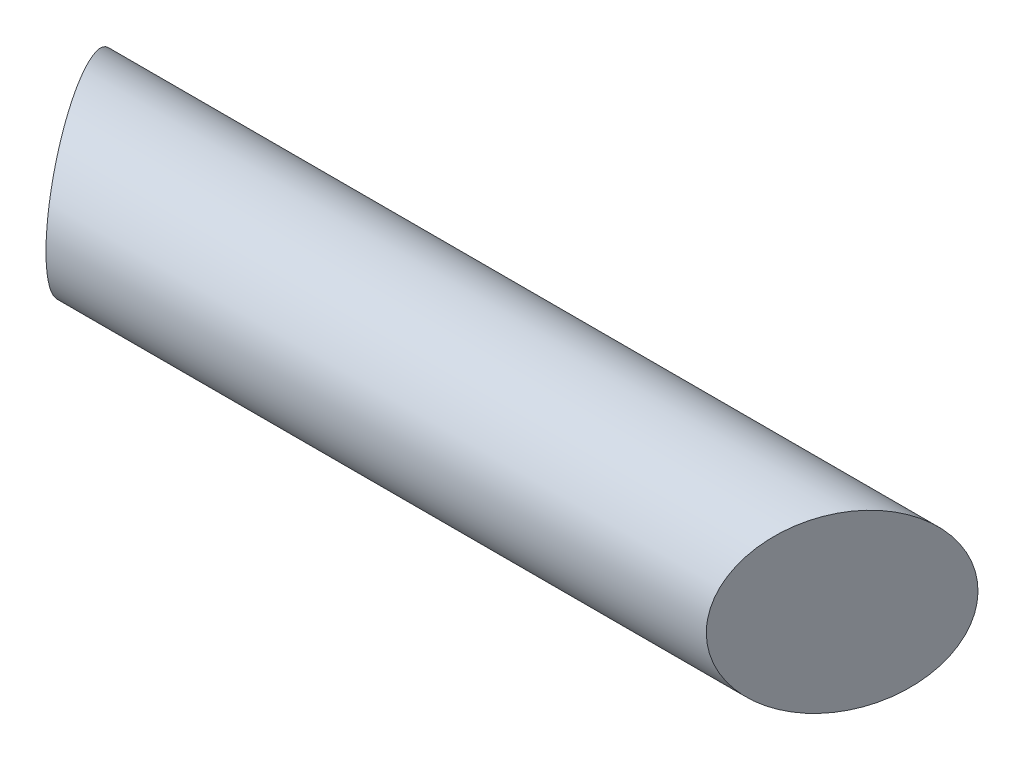
ISO-10303-21;
HEADER;
FILE_DESCRIPTION(('STEP AP214'),'2;1');
FILE_NAME('part.step','',(''),(''),'','','');
FILE_SCHEMA(('AUTOMOTIVE_DESIGN { 1 0 10303 214 1 1 1 1 }'));
ENDSEC;
DATA;
#1=APPLICATION_CONTEXT('core data for automotive mechanical design processes');
#2=APPLICATION_PROTOCOL_DEFINITION('international standard','automotive_design',2000,#1);
#3=PRODUCT_CONTEXT('',#1,'mechanical');
#4=PRODUCT('Part','Part','',(#3));
#5=PRODUCT_RELATED_PRODUCT_CATEGORY('part','',(#4));
#6=PRODUCT_DEFINITION_FORMATION('','',#4);
#7=PRODUCT_DEFINITION_CONTEXT('part definition',#1,'design');
#8=PRODUCT_DEFINITION('design','',#6,#7);
#9=PRODUCT_DEFINITION_SHAPE('','',#8);
#10=(LENGTH_UNIT() NAMED_UNIT(*) SI_UNIT(.MILLI.,.METRE.));
#11=(NAMED_UNIT(*) PLANE_ANGLE_UNIT() SI_UNIT($,.RADIAN.));
#12=(NAMED_UNIT(*) SI_UNIT($,.STERADIAN.) SOLID_ANGLE_UNIT());
#13=UNCERTAINTY_MEASURE_WITH_UNIT(LENGTH_MEASURE(1.E-05),#10,'distance_accuracy_value','');
#14=(GEOMETRIC_REPRESENTATION_CONTEXT(3) GLOBAL_UNCERTAINTY_ASSIGNED_CONTEXT((#13)) GLOBAL_UNIT_ASSIGNED_CONTEXT((#10,
#11,#12)) REPRESENTATION_CONTEXT('',''));
#15=CARTESIAN_POINT('',(0.,0.,0.));
#16=DIRECTION('',(0.,0.,1.));
#17=DIRECTION('',(1.,0.,0.));
#18=AXIS2_PLACEMENT_3D('',#15,#16,#17);
#19=CARTESIAN_POINT('',(150.,0.,0.));
#20=DIRECTION('',(-1.,0.,0.));
#21=DIRECTION('',(0.,0.,1.));
#22=AXIS2_PLACEMENT_3D('',#19,#20,#21);
#23=CYLINDRICAL_SURFACE('',#22,30.);
#24=CARTESIAN_POINT('',(132.320508075689,0.,0.));
#25=DIRECTION('',(0.866025403784438,0.,0.500000000000001));
#26=DIRECTION('',(-0.500000000000001,0.,0.866025403784438));
#27=AXIS2_PLACEMENT_3D('',#24,#25,#26);
#28=ELLIPSE('',#27,34.6410161513776,30.);
#29=CARTESIAN_POINT('',(115.,0.,30.));
#30=VERTEX_POINT('',#29);
#31=EDGE_CURVE('E10',#30,#30,#28,.T.);
#32=ORIENTED_EDGE('',*,*,#31,.F.);
#33=EDGE_LOOP('',(#32));
#34=FACE_BOUND('',#33,.T.);
#35=CARTESIAN_POINT('',(-132.320508075689,0.,0.));
#36=DIRECTION('',(-0.866025403784438,0.,0.500000000000001));
#37=DIRECTION('',(-0.500000000000001,0.,-0.866025403784438));
#38=AXIS2_PLACEMENT_3D('',#35,#36,#37);
#39=ELLIPSE('',#38,34.6410161513776,30.);
#40=CARTESIAN_POINT('',(-149.641016151378,0.,-30.));
#41=VERTEX_POINT('',#40);
#42=EDGE_CURVE('E39',#41,#41,#39,.T.);
#43=ORIENTED_EDGE('',*,*,#42,.F.);
#44=EDGE_LOOP('',(#43));
#45=FACE_BOUND('',#44,.T.);
#46=ADVANCED_FACE('F36',(#34,#45),#23,.T.);
#47=CARTESIAN_POINT('',(99.2403810567665,0.,57.2964607176053));
#48=DIRECTION('',(0.866025403784438,0.,0.500000000000001));
#49=DIRECTION('',(0.500000000000001,0.,-0.866025403784438));
#50=AXIS2_PLACEMENT_3D('',#47,#48,#49);
#51=PLANE('',#50);
#52=ORIENTED_EDGE('',*,*,#31,.T.);
#53=EDGE_LOOP('',(#52));
#54=FACE_BOUND('',#53,.T.);
#55=ADVANCED_FACE('F53',(#54),#51,.T.);
#56=CARTESIAN_POINT('',(-99.2403810567665,0.,57.2964607176053));
#57=DIRECTION('',(-0.866025403784438,0.,0.500000000000001));
#58=DIRECTION('',(-0.500000000000001,0.,-0.866025403784438));
#59=AXIS2_PLACEMENT_3D('',#56,#57,#58);
#60=PLANE('',#59);
#61=ORIENTED_EDGE('',*,*,#42,.T.);
#62=EDGE_LOOP('',(#61));
#63=FACE_BOUND('',#62,.T.);
#64=ADVANCED_FACE('F50',(#63),#60,.T.);
#65=CLOSED_SHELL('',(#46,#55,#64));
#66=MANIFOLD_SOLID_BREP('B2',#65);
#67=ADVANCED_BREP_SHAPE_REPRESENTATION('',(#18,#66),#14);
#68=SHAPE_DEFINITION_REPRESENTATION(#9,#67);
ENDSEC;
END-ISO-10303-21;
